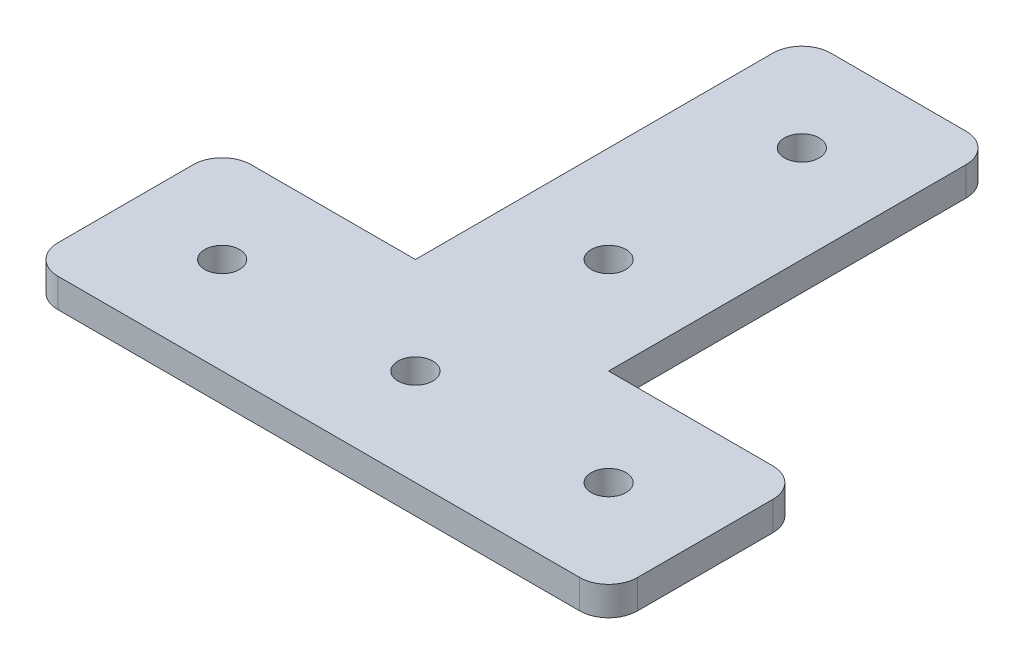
ISO-10303-21;
HEADER;
FILE_DESCRIPTION(('STEP AP214'),'2;1');
FILE_NAME('part.step','',(''),(''),'','','');
FILE_SCHEMA(('AUTOMOTIVE_DESIGN { 1 0 10303 214 1 1 1 1 }'));
ENDSEC;
DATA;
#1=APPLICATION_CONTEXT('core data for automotive mechanical design processes');
#2=APPLICATION_PROTOCOL_DEFINITION('international standard','automotive_design',2000,#1);
#3=PRODUCT_CONTEXT('',#1,'mechanical');
#4=PRODUCT('Part','Part','',(#3));
#5=PRODUCT_RELATED_PRODUCT_CATEGORY('part','',(#4));
#6=PRODUCT_DEFINITION_FORMATION('','',#4);
#7=PRODUCT_DEFINITION_CONTEXT('part definition',#1,'design');
#8=PRODUCT_DEFINITION('design','',#6,#7);
#9=PRODUCT_DEFINITION_SHAPE('','',#8);
#10=(LENGTH_UNIT() NAMED_UNIT(*) SI_UNIT(.MILLI.,.METRE.));
#11=(NAMED_UNIT(*) PLANE_ANGLE_UNIT() SI_UNIT($,.RADIAN.));
#12=(NAMED_UNIT(*) SI_UNIT($,.STERADIAN.) SOLID_ANGLE_UNIT());
#13=UNCERTAINTY_MEASURE_WITH_UNIT(LENGTH_MEASURE(1.E-05),#10,'distance_accuracy_value','');
#14=(GEOMETRIC_REPRESENTATION_CONTEXT(3) GLOBAL_UNCERTAINTY_ASSIGNED_CONTEXT((#13)) GLOBAL_UNIT_ASSIGNED_CONTEXT((#10,
#11,#12)) REPRESENTATION_CONTEXT('',''));
#15=CARTESIAN_POINT('',(0.,0.,0.));
#16=DIRECTION('',(0.,0.,1.));
#17=DIRECTION('',(1.,0.,0.));
#18=AXIS2_PLACEMENT_3D('',#15,#16,#17);
#19=CARTESIAN_POINT('',(10.,3.,0.));
#20=DIRECTION('',(1.,0.,0.));
#21=DIRECTION('',(0.,0.,-1.));
#22=AXIS2_PLACEMENT_3D('',#19,#20,#21);
#23=PLANE('',#22);
#24=DIRECTION('',(0.,0.,1.));
#25=VECTOR('',#24,1.);
#26=CARTESIAN_POINT('',(10.,0.,0.));
#27=LINE('',#26,#25);
#28=CARTESIAN_POINT('',(10.,0.,-47.));
#29=VERTEX_POINT('',#28);
#30=CARTESIAN_POINT('',(10.,0.,-10.));
#31=VERTEX_POINT('',#30);
#32=EDGE_CURVE('E353',#29,#31,#27,.T.);
#33=ORIENTED_EDGE('',*,*,#32,.F.);
#34=DIRECTION('',(0.,-1.,0.));
#35=VECTOR('',#34,1.);
#36=CARTESIAN_POINT('',(10.,3.,-47.));
#37=LINE('',#36,#35);
#38=CARTESIAN_POINT('',(10.,3.,-47.));
#39=VERTEX_POINT('',#38);
#40=EDGE_CURVE('E214',#29,#39,#37,.F.);
#41=ORIENTED_EDGE('',*,*,#40,.T.);
#42=DIRECTION('',(0.,0.,1.));
#43=VECTOR('',#42,1.);
#44=CARTESIAN_POINT('',(10.,3.,0.));
#45=LINE('',#44,#43);
#46=CARTESIAN_POINT('',(10.,3.,-10.));
#47=VERTEX_POINT('',#46);
#48=EDGE_CURVE('E317',#39,#47,#45,.T.);
#49=ORIENTED_EDGE('',*,*,#48,.T.);
#50=DIRECTION('',(0.,-1.,0.));
#51=VECTOR('',#50,1.);
#52=CARTESIAN_POINT('',(10.,3.,-10.));
#53=LINE('',#52,#51);
#54=EDGE_CURVE('E181',#47,#31,#53,.T.);
#55=ORIENTED_EDGE('',*,*,#54,.T.);
#56=EDGE_LOOP('',(#33,#41,#49,#55));
#57=FACE_BOUND('',#56,.T.);
#58=ADVANCED_FACE('F50',(#57),#23,.T.);
#59=CARTESIAN_POINT('',(0.,3.,-50.));
#60=DIRECTION('',(0.,0.,-1.));
#61=DIRECTION('',(-1.,0.,0.));
#62=AXIS2_PLACEMENT_3D('',#59,#60,#61);
#63=PLANE('',#62);
#64=DIRECTION('',(1.,0.,0.));
#65=VECTOR('',#64,1.);
#66=CARTESIAN_POINT('',(0.,3.,-50.));
#67=LINE('',#66,#65);
#68=CARTESIAN_POINT('',(-7.,3.,-50.));
#69=VERTEX_POINT('',#68);
#70=CARTESIAN_POINT('',(7.,3.,-50.));
#71=VERTEX_POINT('',#70);
#72=EDGE_CURVE('E172',#69,#71,#67,.T.);
#73=ORIENTED_EDGE('',*,*,#72,.T.);
#74=DIRECTION('',(0.,-1.,0.));
#75=VECTOR('',#74,1.);
#76=CARTESIAN_POINT('',(7.,3.,-50.));
#77=LINE('',#76,#75);
#78=CARTESIAN_POINT('',(7.,0.,-50.));
#79=VERTEX_POINT('',#78);
#80=EDGE_CURVE('E190',#71,#79,#77,.T.);
#81=ORIENTED_EDGE('',*,*,#80,.T.);
#82=DIRECTION('',(1.,0.,0.));
#83=VECTOR('',#82,1.);
#84=CARTESIAN_POINT('',(0.,0.,-50.));
#85=LINE('',#84,#83);
#86=CARTESIAN_POINT('',(-7.,0.,-50.));
#87=VERTEX_POINT('',#86);
#88=EDGE_CURVE('E354',#87,#79,#85,.T.);
#89=ORIENTED_EDGE('',*,*,#88,.F.);
#90=DIRECTION('',(0.,-1.,0.));
#91=VECTOR('',#90,1.);
#92=CARTESIAN_POINT('',(-7.,3.,-50.));
#93=LINE('',#92,#91);
#94=EDGE_CURVE('E185',#87,#69,#93,.F.);
#95=ORIENTED_EDGE('',*,*,#94,.T.);
#96=EDGE_LOOP('',(#73,#81,#89,#95));
#97=FACE_BOUND('',#96,.T.);
#98=ADVANCED_FACE('F385',(#97),#63,.T.);
#99=CARTESIAN_POINT('',(-10.,3.,0.));
#100=DIRECTION('',(1.,0.,0.));
#101=DIRECTION('',(0.,0.,-1.));
#102=AXIS2_PLACEMENT_3D('',#99,#100,#101);
#103=PLANE('',#102);
#104=DIRECTION('',(0.,0.,1.));
#105=VECTOR('',#104,1.);
#106=CARTESIAN_POINT('',(-10.,3.,0.));
#107=LINE('',#106,#105);
#108=CARTESIAN_POINT('',(-10.,3.,-47.));
#109=VERTEX_POINT('',#108);
#110=CARTESIAN_POINT('',(-10.,3.,-10.));
#111=VERTEX_POINT('',#110);
#112=EDGE_CURVE('E165',#109,#111,#107,.T.);
#113=ORIENTED_EDGE('',*,*,#112,.F.);
#114=DIRECTION('',(0.,-1.,0.));
#115=VECTOR('',#114,1.);
#116=CARTESIAN_POINT('',(-10.,0.,-47.));
#117=LINE('',#116,#115);
#118=CARTESIAN_POINT('',(-10.,0.,-47.));
#119=VERTEX_POINT('',#118);
#120=EDGE_CURVE('E11',#109,#119,#117,.T.);
#121=ORIENTED_EDGE('',*,*,#120,.T.);
#122=DIRECTION('',(0.,0.,1.));
#123=VECTOR('',#122,1.);
#124=CARTESIAN_POINT('',(-10.,0.,0.));
#125=LINE('',#124,#123);
#126=CARTESIAN_POINT('',(-10.,0.,-10.));
#127=VERTEX_POINT('',#126);
#128=EDGE_CURVE('E178',#119,#127,#125,.T.);
#129=ORIENTED_EDGE('',*,*,#128,.T.);
#130=DIRECTION('',(0.,-1.,0.));
#131=VECTOR('',#130,1.);
#132=CARTESIAN_POINT('',(-10.,3.,-10.));
#133=LINE('',#132,#131);
#134=EDGE_CURVE('E160',#111,#127,#133,.T.);
#135=ORIENTED_EDGE('',*,*,#134,.F.);
#136=EDGE_LOOP('',(#113,#121,#129,#135));
#137=FACE_BOUND('',#136,.T.);
#138=ADVANCED_FACE('F180',(#137),#103,.F.);
#139=CARTESIAN_POINT('',(0.,3.,-10.));
#140=DIRECTION('',(0.,0.,-1.));
#141=DIRECTION('',(-1.,0.,0.));
#142=AXIS2_PLACEMENT_3D('',#139,#140,#141);
#143=PLANE('',#142);
#144=DIRECTION('',(1.,0.,0.));
#145=VECTOR('',#144,1.);
#146=CARTESIAN_POINT('',(0.,0.,-10.));
#147=LINE('',#146,#145);
#148=CARTESIAN_POINT('',(-27.,0.,-10.));
#149=VERTEX_POINT('',#148);
#150=EDGE_CURVE('E294',#149,#127,#147,.T.);
#151=ORIENTED_EDGE('',*,*,#150,.F.);
#152=DIRECTION('',(0.,-1.,0.));
#153=VECTOR('',#152,1.);
#154=CARTESIAN_POINT('',(-27.,3.,-10.));
#155=LINE('',#154,#153);
#156=CARTESIAN_POINT('',(-27.,3.,-10.));
#157=VERTEX_POINT('',#156);
#158=EDGE_CURVE('E57',#149,#157,#155,.F.);
#159=ORIENTED_EDGE('',*,*,#158,.T.);
#160=DIRECTION('',(1.,0.,0.));
#161=VECTOR('',#160,1.);
#162=CARTESIAN_POINT('',(0.,3.,-10.));
#163=LINE('',#162,#161);
#164=EDGE_CURVE('E155',#157,#111,#163,.T.);
#165=ORIENTED_EDGE('',*,*,#164,.T.);
#166=ORIENTED_EDGE('',*,*,#134,.T.);
#167=EDGE_LOOP('',(#151,#159,#165,#166));
#168=FACE_BOUND('',#167,.T.);
#169=ADVANCED_FACE('F154',(#168),#143,.T.);
#170=CARTESIAN_POINT('',(-30.,3.,0.));
#171=DIRECTION('',(-1.,0.,0.));
#172=DIRECTION('',(0.,0.,1.));
#173=AXIS2_PLACEMENT_3D('',#170,#171,#172);
#174=PLANE('',#173);
#175=DIRECTION('',(0.,0.,-1.));
#176=VECTOR('',#175,1.);
#177=CARTESIAN_POINT('',(-30.,0.,0.));
#178=LINE('',#177,#176);
#179=CARTESIAN_POINT('',(-30.,0.,7.));
#180=VERTEX_POINT('',#179);
#181=CARTESIAN_POINT('',(-30.,0.,-7.));
#182=VERTEX_POINT('',#181);
#183=EDGE_CURVE('E266',#180,#182,#178,.T.);
#184=ORIENTED_EDGE('',*,*,#183,.F.);
#185=DIRECTION('',(0.,-1.,0.));
#186=VECTOR('',#185,1.);
#187=CARTESIAN_POINT('',(-30.,3.,7.));
#188=LINE('',#187,#186);
#189=CARTESIAN_POINT('',(-30.,3.,7.));
#190=VERTEX_POINT('',#189);
#191=EDGE_CURVE('E254',#180,#190,#188,.F.);
#192=ORIENTED_EDGE('',*,*,#191,.T.);
#193=DIRECTION('',(0.,0.,-1.));
#194=VECTOR('',#193,1.);
#195=CARTESIAN_POINT('',(-30.,3.,0.));
#196=LINE('',#195,#194);
#197=CARTESIAN_POINT('',(-30.,3.,-7.));
#198=VERTEX_POINT('',#197);
#199=EDGE_CURVE('E161',#190,#198,#196,.T.);
#200=ORIENTED_EDGE('',*,*,#199,.T.);
#201=DIRECTION('',(0.,-1.,0.));
#202=VECTOR('',#201,1.);
#203=CARTESIAN_POINT('',(-30.,3.,-7.));
#204=LINE('',#203,#202);
#205=EDGE_CURVE('E253',#198,#182,#204,.T.);
#206=ORIENTED_EDGE('',*,*,#205,.T.);
#207=EDGE_LOOP('',(#184,#192,#200,#206));
#208=FACE_BOUND('',#207,.T.);
#209=ADVANCED_FACE('F263',(#208),#174,.T.);
#210=CARTESIAN_POINT('',(0.,3.,10.));
#211=DIRECTION('',(0.,0.,-1.));
#212=DIRECTION('',(-1.,0.,0.));
#213=AXIS2_PLACEMENT_3D('',#210,#211,#212);
#214=PLANE('',#213);
#215=DIRECTION('',(1.,0.,0.));
#216=VECTOR('',#215,1.);
#217=CARTESIAN_POINT('',(0.,0.,10.));
#218=LINE('',#217,#216);
#219=CARTESIAN_POINT('',(-27.,0.,10.));
#220=VERTEX_POINT('',#219);
#221=CARTESIAN_POINT('',(27.,0.,10.));
#222=VERTEX_POINT('',#221);
#223=EDGE_CURVE('E278',#220,#222,#218,.T.);
#224=ORIENTED_EDGE('',*,*,#223,.T.);
#225=DIRECTION('',(0.,-1.,0.));
#226=VECTOR('',#225,1.);
#227=CARTESIAN_POINT('',(27.,3.,10.));
#228=LINE('',#227,#226);
#229=CARTESIAN_POINT('',(27.,3.,10.));
#230=VERTEX_POINT('',#229);
#231=EDGE_CURVE('E247',#222,#230,#228,.F.);
#232=ORIENTED_EDGE('',*,*,#231,.T.);
#233=DIRECTION('',(1.,0.,0.));
#234=VECTOR('',#233,1.);
#235=CARTESIAN_POINT('',(0.,3.,10.));
#236=LINE('',#235,#234);
#237=CARTESIAN_POINT('',(-27.,3.,10.));
#238=VERTEX_POINT('',#237);
#239=EDGE_CURVE('E275',#238,#230,#236,.T.);
#240=ORIENTED_EDGE('',*,*,#239,.F.);
#241=DIRECTION('',(0.,-1.,0.));
#242=VECTOR('',#241,1.);
#243=CARTESIAN_POINT('',(-27.,0.,10.));
#244=LINE('',#243,#242);
#245=EDGE_CURVE('E244',#238,#220,#244,.T.);
#246=ORIENTED_EDGE('',*,*,#245,.T.);
#247=EDGE_LOOP('',(#224,#232,#240,#246));
#248=FACE_BOUND('',#247,.T.);
#249=ADVANCED_FACE('F276',(#248),#214,.F.);
#250=CARTESIAN_POINT('',(30.,3.,0.));
#251=DIRECTION('',(-1.,0.,0.));
#252=DIRECTION('',(0.,0.,1.));
#253=AXIS2_PLACEMENT_3D('',#250,#251,#252);
#254=PLANE('',#253);
#255=DIRECTION('',(0.,0.,-1.));
#256=VECTOR('',#255,1.);
#257=CARTESIAN_POINT('',(30.,0.,0.));
#258=LINE('',#257,#256);
#259=CARTESIAN_POINT('',(30.,0.,7.));
#260=VERTEX_POINT('',#259);
#261=CARTESIAN_POINT('',(30.,0.,-7.));
#262=VERTEX_POINT('',#261);
#263=EDGE_CURVE('E287',#260,#262,#258,.T.);
#264=ORIENTED_EDGE('',*,*,#263,.T.);
#265=DIRECTION('',(0.,-1.,0.));
#266=VECTOR('',#265,1.);
#267=CARTESIAN_POINT('',(30.,3.,-7.));
#268=LINE('',#267,#266);
#269=CARTESIAN_POINT('',(30.,3.,-7.));
#270=VERTEX_POINT('',#269);
#271=EDGE_CURVE('E72',#262,#270,#268,.F.);
#272=ORIENTED_EDGE('',*,*,#271,.T.);
#273=DIRECTION('',(0.,0.,-1.));
#274=VECTOR('',#273,1.);
#275=CARTESIAN_POINT('',(30.,3.,0.));
#276=LINE('',#275,#274);
#277=CARTESIAN_POINT('',(30.,3.,7.));
#278=VERTEX_POINT('',#277);
#279=EDGE_CURVE('E328',#278,#270,#276,.T.);
#280=ORIENTED_EDGE('',*,*,#279,.F.);
#281=DIRECTION('',(0.,-1.,0.));
#282=VECTOR('',#281,1.);
#283=CARTESIAN_POINT('',(30.,3.,7.));
#284=LINE('',#283,#282);
#285=EDGE_CURVE('E236',#278,#260,#284,.T.);
#286=ORIENTED_EDGE('',*,*,#285,.T.);
#287=EDGE_LOOP('',(#264,#272,#280,#286));
#288=FACE_BOUND('',#287,.T.);
#289=ADVANCED_FACE('F425',(#288),#254,.F.);
#290=CARTESIAN_POINT('',(-20.,3.,0.));
#291=DIRECTION('',(0.,-1.,0.));
#292=DIRECTION('',(0.,0.,-1.));
#293=AXIS2_PLACEMENT_3D('',#290,#291,#292);
#294=CYLINDRICAL_SURFACE('',#293,1.8);
#295=CARTESIAN_POINT('',(-20.,3.,0.));
#296=DIRECTION('',(0.,1.,0.));
#297=DIRECTION('',(0.,0.,1.));
#298=AXIS2_PLACEMENT_3D('',#295,#296,#297);
#299=CIRCLE('',#298,1.8);
#300=CARTESIAN_POINT('',(-20.,3.,1.8));
#301=VERTEX_POINT('',#300);
#302=EDGE_CURVE('E338',#301,#301,#299,.T.);
#303=ORIENTED_EDGE('',*,*,#302,.T.);
#304=EDGE_LOOP('',(#303));
#305=FACE_BOUND('',#304,.T.);
#306=CARTESIAN_POINT('',(-20.,0.,0.));
#307=DIRECTION('',(0.,1.,0.));
#308=DIRECTION('',(0.,0.,1.));
#309=AXIS2_PLACEMENT_3D('',#306,#307,#308);
#310=CIRCLE('',#309,1.8);
#311=CARTESIAN_POINT('',(-20.,0.,1.8));
#312=VERTEX_POINT('',#311);
#313=EDGE_CURVE('E305',#312,#312,#310,.T.);
#314=ORIENTED_EDGE('',*,*,#313,.F.);
#315=EDGE_LOOP('',(#314));
#316=FACE_BOUND('',#315,.T.);
#317=ADVANCED_FACE('F416',(#305,#316),#294,.F.);
#318=CARTESIAN_POINT('',(0.,3.,0.));
#319=DIRECTION('',(0.,-1.,0.));
#320=DIRECTION('',(0.,0.,-1.));
#321=AXIS2_PLACEMENT_3D('',#318,#319,#320);
#322=CYLINDRICAL_SURFACE('',#321,1.8);
#323=CARTESIAN_POINT('',(0.,3.,0.));
#324=DIRECTION('',(0.,1.,0.));
#325=DIRECTION('',(0.,0.,1.));
#326=AXIS2_PLACEMENT_3D('',#323,#324,#325);
#327=CIRCLE('',#326,1.8);
#328=CARTESIAN_POINT('',(0.,3.,1.8));
#329=VERTEX_POINT('',#328);
#330=EDGE_CURVE('E335',#329,#329,#327,.T.);
#331=ORIENTED_EDGE('',*,*,#330,.T.);
#332=EDGE_LOOP('',(#331));
#333=FACE_BOUND('',#332,.T.);
#334=CARTESIAN_POINT('',(0.,0.,0.));
#335=DIRECTION('',(0.,1.,0.));
#336=DIRECTION('',(0.,0.,1.));
#337=AXIS2_PLACEMENT_3D('',#334,#335,#336);
#338=CIRCLE('',#337,1.8);
#339=CARTESIAN_POINT('',(0.,0.,1.8));
#340=VERTEX_POINT('',#339);
#341=EDGE_CURVE('E296',#340,#340,#338,.T.);
#342=ORIENTED_EDGE('',*,*,#341,.F.);
#343=EDGE_LOOP('',(#342));
#344=FACE_BOUND('',#343,.T.);
#345=ADVANCED_FACE('F423',(#333,#344),#322,.F.);
#346=CARTESIAN_POINT('',(27.,3.,-10.));
#347=VERTEX_POINT('',#346);
#348=EDGE_CURVE('E163',#47,#347,#163,.T.);
#349=ORIENTED_EDGE('',*,*,#348,.T.);
#350=DIRECTION('',(0.,-1.,0.));
#351=VECTOR('',#350,1.);
#352=CARTESIAN_POINT('',(27.,0.,-10.));
#353=LINE('',#352,#351);
#354=CARTESIAN_POINT('',(27.,0.,-10.));
#355=VERTEX_POINT('',#354);
#356=EDGE_CURVE('E233',#347,#355,#353,.T.);
#357=ORIENTED_EDGE('',*,*,#356,.T.);
#358=EDGE_CURVE('E295',#31,#355,#147,.T.);
#359=ORIENTED_EDGE('',*,*,#358,.F.);
#360=ORIENTED_EDGE('',*,*,#54,.F.);
#361=EDGE_LOOP('',(#349,#357,#359,#360));
#362=FACE_BOUND('',#361,.T.);
#363=ADVANCED_FACE('F364',(#362),#143,.T.);
#364=CARTESIAN_POINT('',(0.,3.,-40.));
#365=DIRECTION('',(0.,-1.,0.));
#366=DIRECTION('',(0.,0.,-1.));
#367=AXIS2_PLACEMENT_3D('',#364,#365,#366);
#368=CYLINDRICAL_SURFACE('',#367,1.8);
#369=CARTESIAN_POINT('',(0.,3.,-40.));
#370=DIRECTION('',(0.,1.,0.));
#371=DIRECTION('',(0.,0.,1.));
#372=AXIS2_PLACEMENT_3D('',#369,#370,#371);
#373=CIRCLE('',#372,1.8);
#374=CARTESIAN_POINT('',(0.,3.,-38.2));
#375=VERTEX_POINT('',#374);
#376=EDGE_CURVE('E311',#375,#375,#373,.T.);
#377=ORIENTED_EDGE('',*,*,#376,.T.);
#378=EDGE_LOOP('',(#377));
#379=FACE_BOUND('',#378,.T.);
#380=CARTESIAN_POINT('',(0.,0.,-40.));
#381=DIRECTION('',(0.,1.,0.));
#382=DIRECTION('',(0.,0.,1.));
#383=AXIS2_PLACEMENT_3D('',#380,#381,#382);
#384=CIRCLE('',#383,1.8);
#385=CARTESIAN_POINT('',(0.,0.,-38.2));
#386=VERTEX_POINT('',#385);
#387=EDGE_CURVE('E350',#386,#386,#384,.T.);
#388=ORIENTED_EDGE('',*,*,#387,.F.);
#389=EDGE_LOOP('',(#388));
#390=FACE_BOUND('',#389,.T.);
#391=ADVANCED_FACE('F391',(#379,#390),#368,.F.);
#392=CARTESIAN_POINT('',(0.,3.,-20.));
#393=DIRECTION('',(0.,-1.,0.));
#394=DIRECTION('',(0.,0.,-1.));
#395=AXIS2_PLACEMENT_3D('',#392,#393,#394);
#396=CYLINDRICAL_SURFACE('',#395,1.8);
#397=CARTESIAN_POINT('',(0.,3.,-20.));
#398=DIRECTION('',(0.,1.,0.));
#399=DIRECTION('',(0.,0.,1.));
#400=AXIS2_PLACEMENT_3D('',#397,#398,#399);
#401=CIRCLE('',#400,1.8);
#402=CARTESIAN_POINT('',(0.,3.,-18.2));
#403=VERTEX_POINT('',#402);
#404=EDGE_CURVE('E306',#403,#403,#401,.T.);
#405=ORIENTED_EDGE('',*,*,#404,.T.);
#406=EDGE_LOOP('',(#405));
#407=FACE_BOUND('',#406,.T.);
#408=CARTESIAN_POINT('',(0.,0.,-20.));
#409=DIRECTION('',(0.,1.,0.));
#410=DIRECTION('',(0.,0.,1.));
#411=AXIS2_PLACEMENT_3D('',#408,#409,#410);
#412=CIRCLE('',#411,1.8);
#413=CARTESIAN_POINT('',(0.,0.,-18.2));
#414=VERTEX_POINT('',#413);
#415=EDGE_CURVE('E342',#414,#414,#412,.T.);
#416=ORIENTED_EDGE('',*,*,#415,.F.);
#417=EDGE_LOOP('',(#416));
#418=FACE_BOUND('',#417,.T.);
#419=ADVANCED_FACE('F396',(#407,#418),#396,.F.);
#420=CARTESIAN_POINT('',(20.,3.,0.));
#421=DIRECTION('',(0.,-1.,0.));
#422=DIRECTION('',(0.,0.,-1.));
#423=AXIS2_PLACEMENT_3D('',#420,#421,#422);
#424=CYLINDRICAL_SURFACE('',#423,1.8);
#425=CARTESIAN_POINT('',(20.,3.,0.));
#426=DIRECTION('',(0.,1.,0.));
#427=DIRECTION('',(0.,0.,1.));
#428=AXIS2_PLACEMENT_3D('',#425,#426,#427);
#429=CIRCLE('',#428,1.8);
#430=CARTESIAN_POINT('',(20.,3.,1.8));
#431=VERTEX_POINT('',#430);
#432=EDGE_CURVE('E187',#431,#431,#429,.T.);
#433=ORIENTED_EDGE('',*,*,#432,.T.);
#434=EDGE_LOOP('',(#433));
#435=FACE_BOUND('',#434,.T.);
#436=CARTESIAN_POINT('',(20.,0.,0.));
#437=DIRECTION('',(0.,1.,0.));
#438=DIRECTION('',(0.,0.,1.));
#439=AXIS2_PLACEMENT_3D('',#436,#437,#438);
#440=CIRCLE('',#439,1.8);
#441=CARTESIAN_POINT('',(20.,0.,1.8));
#442=VERTEX_POINT('',#441);
#443=EDGE_CURVE('E304',#442,#442,#440,.T.);
#444=ORIENTED_EDGE('',*,*,#443,.F.);
#445=EDGE_LOOP('',(#444));
#446=FACE_BOUND('',#445,.T.);
#447=ADVANCED_FACE('F398',(#435,#446),#424,.F.);
#448=CARTESIAN_POINT('',(0.,3.,0.));
#449=DIRECTION('',(0.,1.,0.));
#450=DIRECTION('',(0.,0.,1.));
#451=AXIS2_PLACEMENT_3D('',#448,#449,#450);
#452=PLANE('',#451);
#453=ORIENTED_EDGE('',*,*,#404,.F.);
#454=EDGE_LOOP('',(#453));
#455=FACE_BOUND('',#454,.T.);
#456=ORIENTED_EDGE('',*,*,#376,.F.);
#457=EDGE_LOOP('',(#456));
#458=FACE_BOUND('',#457,.T.);
#459=ORIENTED_EDGE('',*,*,#48,.F.);
#460=CARTESIAN_POINT('',(7.,3.,-47.));
#461=DIRECTION('',(0.,1.,0.));
#462=DIRECTION('',(0.,0.,1.));
#463=AXIS2_PLACEMENT_3D('',#460,#461,#462);
#464=CIRCLE('',#463,3.);
#465=EDGE_CURVE('E231',#39,#71,#464,.T.);
#466=ORIENTED_EDGE('',*,*,#465,.T.);
#467=ORIENTED_EDGE('',*,*,#72,.F.);
#468=CARTESIAN_POINT('',(-7.,3.,-47.));
#469=DIRECTION('',(0.,1.,0.));
#470=DIRECTION('',(0.,0.,1.));
#471=AXIS2_PLACEMENT_3D('',#468,#469,#470);
#472=CIRCLE('',#471,3.);
#473=EDGE_CURVE('E173',#69,#109,#472,.T.);
#474=ORIENTED_EDGE('',*,*,#473,.T.);
#475=ORIENTED_EDGE('',*,*,#112,.T.);
#476=ORIENTED_EDGE('',*,*,#164,.F.);
#477=CARTESIAN_POINT('',(-27.,3.,-7.));
#478=DIRECTION('',(0.,1.,0.));
#479=DIRECTION('',(0.,0.,1.));
#480=AXIS2_PLACEMENT_3D('',#477,#478,#479);
#481=CIRCLE('',#480,3.);
#482=EDGE_CURVE('E219',#157,#198,#481,.T.);
#483=ORIENTED_EDGE('',*,*,#482,.T.);
#484=ORIENTED_EDGE('',*,*,#199,.F.);
#485=CARTESIAN_POINT('',(-27.,3.,7.));
#486=DIRECTION('',(0.,1.,0.));
#487=DIRECTION('',(0.,0.,1.));
#488=AXIS2_PLACEMENT_3D('',#485,#486,#487);
#489=CIRCLE('',#488,3.);
#490=EDGE_CURVE('E224',#190,#238,#489,.T.);
#491=ORIENTED_EDGE('',*,*,#490,.T.);
#492=ORIENTED_EDGE('',*,*,#239,.T.);
#493=CARTESIAN_POINT('',(27.,3.,7.));
#494=DIRECTION('',(0.,1.,0.));
#495=DIRECTION('',(0.,0.,1.));
#496=AXIS2_PLACEMENT_3D('',#493,#494,#495);
#497=CIRCLE('',#496,3.);
#498=EDGE_CURVE('E228',#230,#278,#497,.T.);
#499=ORIENTED_EDGE('',*,*,#498,.T.);
#500=ORIENTED_EDGE('',*,*,#279,.T.);
#501=CARTESIAN_POINT('',(27.,3.,-7.));
#502=DIRECTION('',(0.,1.,0.));
#503=DIRECTION('',(0.,0.,1.));
#504=AXIS2_PLACEMENT_3D('',#501,#502,#503);
#505=CIRCLE('',#504,3.);
#506=EDGE_CURVE('E61',#270,#347,#505,.T.);
#507=ORIENTED_EDGE('',*,*,#506,.T.);
#508=ORIENTED_EDGE('',*,*,#348,.F.);
#509=EDGE_LOOP('',(#459,#466,#467,#474,#475,#476,#483,#484,#491,#492,#499,#500,#507,#508));
#510=FACE_BOUND('',#509,.T.);
#511=ORIENTED_EDGE('',*,*,#330,.F.);
#512=EDGE_LOOP('',(#511));
#513=FACE_BOUND('',#512,.T.);
#514=ORIENTED_EDGE('',*,*,#302,.F.);
#515=EDGE_LOOP('',(#514));
#516=FACE_BOUND('',#515,.T.);
#517=ORIENTED_EDGE('',*,*,#432,.F.);
#518=EDGE_LOOP('',(#517));
#519=FACE_BOUND('',#518,.T.);
#520=ADVANCED_FACE('F170',(#455,#458,#510,#513,#516,#519),#452,.T.);
#521=CARTESIAN_POINT('',(0.,0.,0.));
#522=DIRECTION('',(0.,1.,0.));
#523=DIRECTION('',(0.,0.,1.));
#524=AXIS2_PLACEMENT_3D('',#521,#522,#523);
#525=PLANE('',#524);
#526=ORIENTED_EDGE('',*,*,#415,.T.);
#527=EDGE_LOOP('',(#526));
#528=FACE_BOUND('',#527,.T.);
#529=ORIENTED_EDGE('',*,*,#387,.T.);
#530=EDGE_LOOP('',(#529));
#531=FACE_BOUND('',#530,.T.);
#532=ORIENTED_EDGE('',*,*,#88,.T.);
#533=CARTESIAN_POINT('',(7.,0.,-47.));
#534=DIRECTION('',(0.,1.,0.));
#535=DIRECTION('',(0.,0.,1.));
#536=AXIS2_PLACEMENT_3D('',#533,#534,#535);
#537=CIRCLE('',#536,3.);
#538=EDGE_CURVE('E215',#79,#29,#537,.F.);
#539=ORIENTED_EDGE('',*,*,#538,.T.);
#540=ORIENTED_EDGE('',*,*,#32,.T.);
#541=ORIENTED_EDGE('',*,*,#358,.T.);
#542=CARTESIAN_POINT('',(27.,0.,-7.));
#543=DIRECTION('',(0.,1.,0.));
#544=DIRECTION('',(0.,0.,1.));
#545=AXIS2_PLACEMENT_3D('',#542,#543,#544);
#546=CIRCLE('',#545,3.);
#547=EDGE_CURVE('E207',#355,#262,#546,.F.);
#548=ORIENTED_EDGE('',*,*,#547,.T.);
#549=ORIENTED_EDGE('',*,*,#263,.F.);
#550=CARTESIAN_POINT('',(27.,0.,7.));
#551=DIRECTION('',(0.,1.,0.));
#552=DIRECTION('',(0.,0.,1.));
#553=AXIS2_PLACEMENT_3D('',#550,#551,#552);
#554=CIRCLE('',#553,3.);
#555=EDGE_CURVE('E206',#260,#222,#554,.F.);
#556=ORIENTED_EDGE('',*,*,#555,.T.);
#557=ORIENTED_EDGE('',*,*,#223,.F.);
#558=CARTESIAN_POINT('',(-27.,0.,7.));
#559=DIRECTION('',(0.,1.,0.));
#560=DIRECTION('',(0.,0.,1.));
#561=AXIS2_PLACEMENT_3D('',#558,#559,#560);
#562=CIRCLE('',#561,3.);
#563=EDGE_CURVE('E201',#220,#180,#562,.F.);
#564=ORIENTED_EDGE('',*,*,#563,.T.);
#565=ORIENTED_EDGE('',*,*,#183,.T.);
#566=CARTESIAN_POINT('',(-27.,0.,-7.));
#567=DIRECTION('',(0.,1.,0.));
#568=DIRECTION('',(0.,0.,1.));
#569=AXIS2_PLACEMENT_3D('',#566,#567,#568);
#570=CIRCLE('',#569,3.);
#571=EDGE_CURVE('E199',#182,#149,#570,.F.);
#572=ORIENTED_EDGE('',*,*,#571,.T.);
#573=ORIENTED_EDGE('',*,*,#150,.T.);
#574=ORIENTED_EDGE('',*,*,#128,.F.);
#575=CARTESIAN_POINT('',(-7.,0.,-47.));
#576=DIRECTION('',(0.,1.,0.));
#577=DIRECTION('',(0.,0.,1.));
#578=AXIS2_PLACEMENT_3D('',#575,#576,#577);
#579=CIRCLE('',#578,3.);
#580=EDGE_CURVE('E197',#119,#87,#579,.F.);
#581=ORIENTED_EDGE('',*,*,#580,.T.);
#582=EDGE_LOOP('',(#532,#539,#540,#541,#548,#549,#556,#557,#564,#565,#572,#573,#574,#581));
#583=FACE_BOUND('',#582,.T.);
#584=ORIENTED_EDGE('',*,*,#341,.T.);
#585=EDGE_LOOP('',(#584));
#586=FACE_BOUND('',#585,.T.);
#587=ORIENTED_EDGE('',*,*,#313,.T.);
#588=EDGE_LOOP('',(#587));
#589=FACE_BOUND('',#588,.T.);
#590=ORIENTED_EDGE('',*,*,#443,.T.);
#591=EDGE_LOOP('',(#590));
#592=FACE_BOUND('',#591,.T.);
#593=ADVANCED_FACE('F284',(#528,#531,#583,#586,#589,#592),#525,.F.);
#594=CARTESIAN_POINT('',(7.,3.,-47.));
#595=DIRECTION('',(0.,-1.,0.));
#596=DIRECTION('',(0.,0.,-1.));
#597=AXIS2_PLACEMENT_3D('',#594,#595,#596);
#598=CYLINDRICAL_SURFACE('',#597,3.);
#599=ORIENTED_EDGE('',*,*,#465,.F.);
#600=ORIENTED_EDGE('',*,*,#40,.F.);
#601=ORIENTED_EDGE('',*,*,#538,.F.);
#602=ORIENTED_EDGE('',*,*,#80,.F.);
#603=EDGE_LOOP('',(#599,#600,#601,#602));
#604=FACE_BOUND('',#603,.T.);
#605=ADVANCED_FACE('F371',(#604),#598,.T.);
#606=CARTESIAN_POINT('',(27.,3.,-7.));
#607=DIRECTION('',(0.,1.,0.));
#608=DIRECTION('',(0.,0.,1.));
#609=AXIS2_PLACEMENT_3D('',#606,#607,#608);
#610=CYLINDRICAL_SURFACE('',#609,3.);
#611=ORIENTED_EDGE('',*,*,#506,.F.);
#612=ORIENTED_EDGE('',*,*,#271,.F.);
#613=ORIENTED_EDGE('',*,*,#547,.F.);
#614=ORIENTED_EDGE('',*,*,#356,.F.);
#615=EDGE_LOOP('',(#611,#612,#613,#614));
#616=FACE_BOUND('',#615,.T.);
#617=ADVANCED_FACE('F366',(#616),#610,.T.);
#618=CARTESIAN_POINT('',(27.,3.,7.));
#619=DIRECTION('',(0.,-1.,0.));
#620=DIRECTION('',(0.,0.,-1.));
#621=AXIS2_PLACEMENT_3D('',#618,#619,#620);
#622=CYLINDRICAL_SURFACE('',#621,3.);
#623=ORIENTED_EDGE('',*,*,#498,.F.);
#624=ORIENTED_EDGE('',*,*,#231,.F.);
#625=ORIENTED_EDGE('',*,*,#555,.F.);
#626=ORIENTED_EDGE('',*,*,#285,.F.);
#627=EDGE_LOOP('',(#623,#624,#625,#626));
#628=FACE_BOUND('',#627,.T.);
#629=ADVANCED_FACE('F367',(#628),#622,.T.);
#630=CARTESIAN_POINT('',(-27.,3.,7.));
#631=DIRECTION('',(0.,1.,0.));
#632=DIRECTION('',(0.,0.,1.));
#633=AXIS2_PLACEMENT_3D('',#630,#631,#632);
#634=CYLINDRICAL_SURFACE('',#633,3.);
#635=ORIENTED_EDGE('',*,*,#490,.F.);
#636=ORIENTED_EDGE('',*,*,#191,.F.);
#637=ORIENTED_EDGE('',*,*,#563,.F.);
#638=ORIENTED_EDGE('',*,*,#245,.F.);
#639=EDGE_LOOP('',(#635,#636,#637,#638));
#640=FACE_BOUND('',#639,.T.);
#641=ADVANCED_FACE('F274',(#640),#634,.T.);
#642=CARTESIAN_POINT('',(-27.,3.,-7.));
#643=DIRECTION('',(0.,-1.,0.));
#644=DIRECTION('',(0.,0.,-1.));
#645=AXIS2_PLACEMENT_3D('',#642,#643,#644);
#646=CYLINDRICAL_SURFACE('',#645,3.);
#647=ORIENTED_EDGE('',*,*,#482,.F.);
#648=ORIENTED_EDGE('',*,*,#158,.F.);
#649=ORIENTED_EDGE('',*,*,#571,.F.);
#650=ORIENTED_EDGE('',*,*,#205,.F.);
#651=EDGE_LOOP('',(#647,#648,#649,#650));
#652=FACE_BOUND('',#651,.T.);
#653=ADVANCED_FACE('F501',(#652),#646,.T.);
#654=CARTESIAN_POINT('',(-7.,3.,-47.));
#655=DIRECTION('',(0.,1.,0.));
#656=DIRECTION('',(0.,0.,1.));
#657=AXIS2_PLACEMENT_3D('',#654,#655,#656);
#658=CYLINDRICAL_SURFACE('',#657,3.);
#659=ORIENTED_EDGE('',*,*,#473,.F.);
#660=ORIENTED_EDGE('',*,*,#94,.F.);
#661=ORIENTED_EDGE('',*,*,#580,.F.);
#662=ORIENTED_EDGE('',*,*,#120,.F.);
#663=EDGE_LOOP('',(#659,#660,#661,#662));
#664=FACE_BOUND('',#663,.T.);
#665=ADVANCED_FACE('F47',(#664),#658,.T.);
#666=CLOSED_SHELL('',(#58,#98,#138,#169,#209,#249,#289,#317,#345,#363,#391,#419,#447,#520,#593,
#605,#617,#629,#641,#653,#665));
#667=MANIFOLD_SOLID_BREP('B2',#666);
#668=ADVANCED_BREP_SHAPE_REPRESENTATION('',(#18,#667),#14);
#669=SHAPE_DEFINITION_REPRESENTATION(#9,#668);
ENDSEC;
END-ISO-10303-21;
